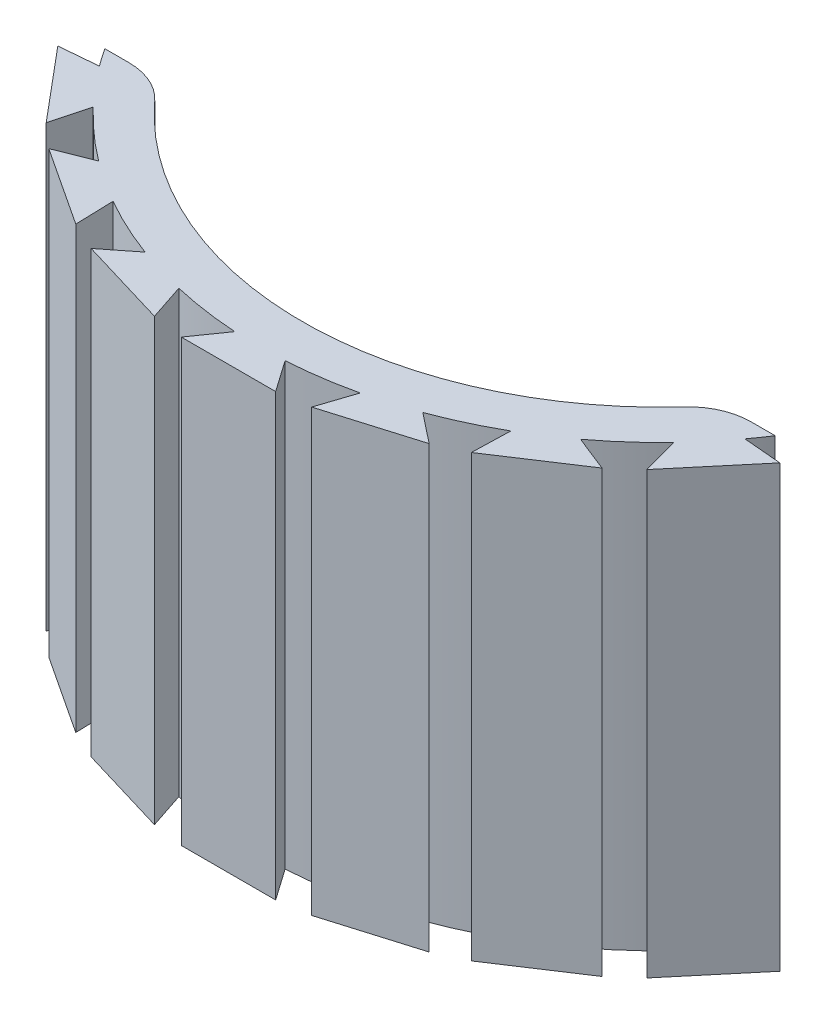
ISO-10303-21;
HEADER;
FILE_DESCRIPTION(('STEP AP214'),'2;1');
FILE_NAME('part.step','',(''),(''),'','','');
FILE_SCHEMA(('AUTOMOTIVE_DESIGN { 1 0 10303 214 1 1 1 1 }'));
ENDSEC;
DATA;
#1=APPLICATION_CONTEXT('core data for automotive mechanical design processes');
#2=APPLICATION_PROTOCOL_DEFINITION('international standard','automotive_design',2000,#1);
#3=PRODUCT_CONTEXT('',#1,'mechanical');
#4=PRODUCT('Part','Part','',(#3));
#5=PRODUCT_RELATED_PRODUCT_CATEGORY('part','',(#4));
#6=PRODUCT_DEFINITION_FORMATION('','',#4);
#7=PRODUCT_DEFINITION_CONTEXT('part definition',#1,'design');
#8=PRODUCT_DEFINITION('design','',#6,#7);
#9=PRODUCT_DEFINITION_SHAPE('','',#8);
#10=(LENGTH_UNIT() NAMED_UNIT(*) SI_UNIT(.MILLI.,.METRE.));
#11=(NAMED_UNIT(*) PLANE_ANGLE_UNIT() SI_UNIT($,.RADIAN.));
#12=(NAMED_UNIT(*) SI_UNIT($,.STERADIAN.) SOLID_ANGLE_UNIT());
#13=UNCERTAINTY_MEASURE_WITH_UNIT(LENGTH_MEASURE(1.E-05),#10,'distance_accuracy_value','');
#14=(GEOMETRIC_REPRESENTATION_CONTEXT(3) GLOBAL_UNCERTAINTY_ASSIGNED_CONTEXT((#13)) GLOBAL_UNIT_ASSIGNED_CONTEXT((#10,
#11,#12)) REPRESENTATION_CONTEXT('',''));
#15=CARTESIAN_POINT('',(0.,0.,0.));
#16=DIRECTION('',(0.,0.,1.));
#17=DIRECTION('',(1.,0.,0.));
#18=AXIS2_PLACEMENT_3D('',#15,#16,#17);
#19=CARTESIAN_POINT('',(-31.5269666317583,35.56,17.78));
#20=DIRECTION('',(0.,0.,1.));
#21=DIRECTION('',(1.,0.,0.));
#22=AXIS2_PLACEMENT_3D('',#19,#20,#21);
#23=PLANE('',#22);
#24=DIRECTION('',(-1.,0.,0.));
#25=VECTOR('',#24,1.);
#26=CARTESIAN_POINT('',(-31.5269666317583,35.56,17.78));
#27=LINE('',#26,#25);
#28=CARTESIAN_POINT('',(-25.1306815715372,35.56,17.78));
#29=VERTEX_POINT('',#28);
#30=CARTESIAN_POINT('',(-27.0676896871528,35.56,17.78));
#31=VERTEX_POINT('',#30);
#32=EDGE_CURVE('E486',#29,#31,#27,.T.);
#33=ORIENTED_EDGE('',*,*,#32,.F.);
#34=DIRECTION('',(0.,-1.,0.));
#35=VECTOR('',#34,1.);
#36=CARTESIAN_POINT('',(-25.1306815715372,35.56,17.78));
#37=LINE('',#36,#35);
#38=CARTESIAN_POINT('',(-25.1306815715372,0.,17.78));
#39=VERTEX_POINT('',#38);
#40=EDGE_CURVE('E488',#29,#39,#37,.T.);
#41=ORIENTED_EDGE('',*,*,#40,.T.);
#42=DIRECTION('',(-1.,0.,0.));
#43=VECTOR('',#42,1.);
#44=CARTESIAN_POINT('',(-31.5269666317583,0.,17.78));
#45=LINE('',#44,#43);
#46=CARTESIAN_POINT('',(-27.0676896871528,0.,17.78));
#47=VERTEX_POINT('',#46);
#48=EDGE_CURVE('E484',#39,#47,#45,.T.);
#49=ORIENTED_EDGE('',*,*,#48,.T.);
#50=DIRECTION('',(0.,-1.,0.));
#51=VECTOR('',#50,1.);
#52=CARTESIAN_POINT('',(-27.0676896871528,35.56,17.78));
#53=LINE('',#52,#51);
#54=EDGE_CURVE('E467',#31,#47,#53,.T.);
#55=ORIENTED_EDGE('',*,*,#54,.F.);
#56=EDGE_LOOP('',(#33,#41,#49,#55));
#57=FACE_BOUND('',#56,.T.);
#58=ADVANCED_FACE('F41',(#57),#23,.F.);
#59=CARTESIAN_POINT('',(0.,35.56,0.));
#60=DIRECTION('',(0.,1.,0.));
#61=DIRECTION('',(0.,0.,1.));
#62=AXIS2_PLACEMENT_3D('',#59,#60,#61);
#63=PLANE('',#62);
#64=CARTESIAN_POINT('',(0.,35.56,0.));
#65=DIRECTION('',(0.,-1.,0.));
#66=DIRECTION('',(0.,0.,1.));
#67=AXIS2_PLACEMENT_3D('',#64,#65,#66);
#68=CIRCLE('',#67,28.8925);
#69=CARTESIAN_POINT('',(21.3728226449522,35.56,19.4416822429907));
#70=VERTEX_POINT('',#69);
#71=CARTESIAN_POINT('',(-21.3728226449522,35.56,19.4416822429907));
#72=VERTEX_POINT('',#71);
#73=EDGE_CURVE('E483',#70,#72,#68,.T.);
#74=ORIENTED_EDGE('',*,*,#73,.T.);
#75=CARTESIAN_POINT('',(-25.1306815715372,35.56,22.86));
#76=DIRECTION('',(0.,1.,0.));
#77=DIRECTION('',(0.,0.,1.));
#78=AXIS2_PLACEMENT_3D('',#75,#76,#77);
#79=CIRCLE('',#78,5.08);
#80=EDGE_CURVE('E49',#72,#29,#79,.T.);
#81=ORIENTED_EDGE('',*,*,#80,.T.);
#82=ORIENTED_EDGE('',*,*,#32,.T.);
#83=CARTESIAN_POINT('',(0.,35.56,0.));
#84=DIRECTION('',(0.,1.,0.));
#85=DIRECTION('',(0.,0.,1.));
#86=AXIS2_PLACEMENT_3D('',#83,#84,#85);
#87=CIRCLE('',#86,32.385);
#88=CARTESIAN_POINT('',(-26.0652975121526,35.56,19.2194820586552));
#89=VERTEX_POINT('',#88);
#90=EDGE_CURVE('E465',#31,#89,#87,.T.);
#91=ORIENTED_EDGE('',*,*,#90,.T.);
#92=DIRECTION('',(-0.996194698091746,0.,0.0871557427476514));
#93=VECTOR('',#92,1.);
#94=CARTESIAN_POINT('',(-26.0652975121526,35.56,19.2194820586552));
#95=LINE('',#94,#93);
#96=CARTESIAN_POINT('',(-29.1542656112915,35.56,19.4897317493231));
#97=VERTEX_POINT('',#96);
#98=EDGE_CURVE('E322',#89,#97,#95,.T.);
#99=ORIENTED_EDGE('',*,*,#98,.T.);
#100=DIRECTION('',(0.642787609686538,0.,0.766044443118979));
#101=VECTOR('',#100,1.);
#102=CARTESIAN_POINT('',(-29.1542656112915,35.56,19.4897317493231));
#103=LINE('',#102,#101);
#104=CARTESIAN_POINT('',(-24.25622402548,35.56,25.3269904058897));
#105=VERTEX_POINT('',#104);
#106=EDGE_CURVE('E325',#97,#105,#103,.T.);
#107=ORIENTED_EDGE('',*,*,#106,.T.);
#108=DIRECTION('',(0.258819045102518,0.,-0.965925826289069));
#109=VECTOR('',#108,1.);
#110=CARTESIAN_POINT('',(-23.4536863535744,35.56,22.3318790393499));
#111=LINE('',#110,#109);
#112=CARTESIAN_POINT('',(-23.4536863535744,35.56,22.3318790393499));
#113=VERTEX_POINT('',#112);
#114=EDGE_CURVE('E316',#105,#113,#111,.T.);
#115=ORIENTED_EDGE('',*,*,#114,.T.);
#116=CARTESIAN_POINT('',(-19.4580720665701,35.56,25.8876738323891));
#117=VERTEX_POINT('',#116);
#118=EDGE_CURVE('E468',#113,#117,#87,.T.);
#119=ORIENTED_EDGE('',*,*,#118,.T.);
#120=DIRECTION('',(-0.929347524226825,0.,0.369206147312679));
#121=VECTOR('',#120,1.);
#122=CARTESIAN_POINT('',(-19.4580720665701,35.56,25.8876738323891));
#123=LINE('',#122,#121);
#124=CARTESIAN_POINT('',(-22.3397626244995,35.56,27.0324962383299));
#125=VERTEX_POINT('',#124);
#126=EDGE_CURVE('E271',#117,#125,#123,.T.);
#127=ORIENTED_EDGE('',*,*,#126,.T.);
#128=DIRECTION('',(0.835487811412936,0.,0.549508978070807));
#129=VECTOR('',#128,1.);
#130=CARTESIAN_POINT('',(-22.3397626244995,35.56,27.0324962383299));
#131=LINE('',#130,#129);
#132=CARTESIAN_POINT('',(-15.9733455015329,35.56,31.2197546512294));
#133=VERTEX_POINT('',#132);
#134=EDGE_CURVE('E298',#125,#133,#131,.T.);
#135=ORIENTED_EDGE('',*,*,#134,.T.);
#136=DIRECTION('',(-0.029084718743115,0.,-0.9995769500822));
#137=VECTOR('',#136,1.);
#138=CARTESIAN_POINT('',(-16.0635304508626,35.56,28.1202989751924));
#139=LINE('',#138,#137);
#140=CARTESIAN_POINT('',(-16.0635304508626,35.56,28.1202989751924));
#141=VERTEX_POINT('',#140);
#142=EDGE_CURVE('E294',#133,#141,#139,.T.);
#143=ORIENTED_EDGE('',*,*,#142,.T.);
#144=CARTESIAN_POINT('',(-11.2159604271536,35.56,30.3807580006906));
#145=VERTEX_POINT('',#144);
#146=EDGE_CURVE('E537',#141,#145,#87,.T.);
#147=ORIENTED_EDGE('',*,*,#146,.T.);
#148=DIRECTION('',(-0.784415664919579,0.,0.620235491268256));
#149=VECTOR('',#148,1.);
#150=CARTESIAN_POINT('',(-11.2159604271536,35.56,30.3807580006906));
#151=LINE('',#150,#149);
#152=CARTESIAN_POINT('',(-13.6482509924846,35.56,32.3039640267328));
#153=VERTEX_POINT('',#152);
#154=EDGE_CURVE('E308',#145,#153,#151,.T.);
#155=ORIENTED_EDGE('',*,*,#154,.T.);
#156=DIRECTION('',(0.957989512315489,0.,0.286803232711091));
#157=VECTOR('',#156,1.);
#158=CARTESIAN_POINT('',(-13.6482509924846,35.56,32.3039640267328));
#159=LINE('',#158,#157);
#160=CARTESIAN_POINT('',(-6.34837090864062,35.56,34.4894046599913));
#161=VERTEX_POINT('',#160);
#162=EDGE_CURVE('E427',#153,#161,#159,.T.);
#163=ORIENTED_EDGE('',*,*,#162,.T.);
#164=DIRECTION('',(-0.314544756151618,0.,-0.949242643573033));
#165=VECTOR('',#164,1.);
#166=CARTESIAN_POINT('',(-7.3237010517993,35.56,31.5460239634708));
#167=LINE('',#166,#165);
#168=CARTESIAN_POINT('',(-7.3237010517993,35.56,31.5460239634708));
#169=VERTEX_POINT('',#168);
#170=EDGE_CURVE('E418',#161,#169,#167,.T.);
#171=ORIENTED_EDGE('',*,*,#170,.T.);
#172=CARTESIAN_POINT('',(-2.03147285294732,35.56,32.3212212493238));
#173=VERTEX_POINT('',#172);
#174=EDGE_CURVE('E533',#169,#173,#87,.T.);
#175=ORIENTED_EDGE('',*,*,#174,.T.);
#176=DIRECTION('',(-0.57357643635105,0.,0.819152044288989));
#177=VECTOR('',#176,1.);
#178=CARTESIAN_POINT('',(-2.03147285294732,35.56,32.3212212493238));
#179=LINE('',#178,#177);
#180=CARTESIAN_POINT('',(-3.81,35.56,34.8612212493238));
#181=VERTEX_POINT('',#180);
#182=EDGE_CURVE('E434',#173,#181,#179,.T.);
#183=ORIENTED_EDGE('',*,*,#182,.T.);
#184=DIRECTION('',(1.,0.,0.));
#185=VECTOR('',#184,1.);
#186=CARTESIAN_POINT('',(-3.81,35.56,34.8612212493238));
#187=LINE('',#186,#185);
#188=CARTESIAN_POINT('',(3.81,35.56,34.8612212493238));
#189=VERTEX_POINT('',#188);
#190=EDGE_CURVE('E453',#181,#189,#187,.T.);
#191=ORIENTED_EDGE('',*,*,#190,.T.);
#192=DIRECTION('',(-0.57357643635105,0.,-0.819152044288989));
#193=VECTOR('',#192,1.);
#194=CARTESIAN_POINT('',(2.03147285294732,35.56,32.3212212493238));
#195=LINE('',#194,#193);
#196=CARTESIAN_POINT('',(2.03147285294732,35.56,32.3212212493238));
#197=VERTEX_POINT('',#196);
#198=EDGE_CURVE('E444',#189,#197,#195,.T.);
#199=ORIENTED_EDGE('',*,*,#198,.T.);
#200=CARTESIAN_POINT('',(7.3237010517993,35.56,31.5460239634708));
#201=VERTEX_POINT('',#200);
#202=EDGE_CURVE('E470',#197,#201,#87,.T.);
#203=ORIENTED_EDGE('',*,*,#202,.T.);
#204=DIRECTION('',(-0.314544756151618,0.,0.949242643573033));
#205=VECTOR('',#204,1.);
#206=CARTESIAN_POINT('',(7.3237010517993,35.56,31.5460239634708));
#207=LINE('',#206,#205);
#208=CARTESIAN_POINT('',(6.34837090864062,35.56,34.4894046599913));
#209=VERTEX_POINT('',#208);
#210=EDGE_CURVE('E348',#201,#209,#207,.T.);
#211=ORIENTED_EDGE('',*,*,#210,.T.);
#212=DIRECTION('',(0.957989512315489,0.,-0.286803232711091));
#213=VECTOR('',#212,1.);
#214=CARTESIAN_POINT('',(6.34837090864062,35.56,34.4894046599913));
#215=LINE('',#214,#213);
#216=CARTESIAN_POINT('',(13.6482509924846,35.56,32.3039640267328));
#217=VERTEX_POINT('',#216);
#218=EDGE_CURVE('E351',#209,#217,#215,.T.);
#219=ORIENTED_EDGE('',*,*,#218,.T.);
#220=DIRECTION('',(-0.784415664919579,0.,-0.620235491268256));
#221=VECTOR('',#220,1.);
#222=CARTESIAN_POINT('',(11.2159604271536,35.56,30.3807580006906));
#223=LINE('',#222,#221);
#224=CARTESIAN_POINT('',(11.2159604271536,35.56,30.3807580006906));
#225=VERTEX_POINT('',#224);
#226=EDGE_CURVE('E341',#217,#225,#223,.T.);
#227=ORIENTED_EDGE('',*,*,#226,.T.);
#228=CARTESIAN_POINT('',(16.0635304508626,35.56,28.1202989751924));
#229=VERTEX_POINT('',#228);
#230=EDGE_CURVE('E530',#225,#229,#87,.T.);
#231=ORIENTED_EDGE('',*,*,#230,.T.);
#232=DIRECTION('',(-0.029084718743115,0.,0.9995769500822));
#233=VECTOR('',#232,1.);
#234=CARTESIAN_POINT('',(16.0635304508626,35.56,28.1202989751924));
#235=LINE('',#234,#233);
#236=CARTESIAN_POINT('',(15.9733455015329,35.56,31.2197546512294));
#237=VERTEX_POINT('',#236);
#238=EDGE_CURVE('E374',#229,#237,#235,.T.);
#239=ORIENTED_EDGE('',*,*,#238,.T.);
#240=DIRECTION('',(0.835487811412936,0.,-0.549508978070807));
#241=VECTOR('',#240,1.);
#242=CARTESIAN_POINT('',(15.9733455015329,35.56,31.2197546512294));
#243=LINE('',#242,#241);
#244=CARTESIAN_POINT('',(22.3397626244995,35.56,27.0324962383299));
#245=VERTEX_POINT('',#244);
#246=EDGE_CURVE('E377',#237,#245,#243,.T.);
#247=ORIENTED_EDGE('',*,*,#246,.T.);
#248=DIRECTION('',(-0.929347524226825,0.,-0.369206147312679));
#249=VECTOR('',#248,1.);
#250=CARTESIAN_POINT('',(19.4580720665701,35.56,25.8876738323891));
#251=LINE('',#250,#249);
#252=CARTESIAN_POINT('',(19.4580720665701,35.56,25.8876738323891));
#253=VERTEX_POINT('',#252);
#254=EDGE_CURVE('E367',#245,#253,#251,.T.);
#255=ORIENTED_EDGE('',*,*,#254,.T.);
#256=CARTESIAN_POINT('',(23.4536863535744,35.56,22.3318790393499));
#257=VERTEX_POINT('',#256);
#258=EDGE_CURVE('E528',#253,#257,#87,.T.);
#259=ORIENTED_EDGE('',*,*,#258,.T.);
#260=DIRECTION('',(0.258819045102518,0.,0.965925826289069));
#261=VECTOR('',#260,1.);
#262=CARTESIAN_POINT('',(23.4536863535744,35.56,22.3318790393499));
#263=LINE('',#262,#261);
#264=CARTESIAN_POINT('',(24.25622402548,35.56,25.3269904058897));
#265=VERTEX_POINT('',#264);
#266=EDGE_CURVE('E400',#257,#265,#263,.T.);
#267=ORIENTED_EDGE('',*,*,#266,.T.);
#268=DIRECTION('',(0.642787609686538,0.,-0.766044443118979));
#269=VECTOR('',#268,1.);
#270=CARTESIAN_POINT('',(24.25622402548,35.56,25.3269904058897));
#271=LINE('',#270,#269);
#272=CARTESIAN_POINT('',(29.1542656112915,35.56,19.4897317493231));
#273=VERTEX_POINT('',#272);
#274=EDGE_CURVE('E403',#265,#273,#271,.T.);
#275=ORIENTED_EDGE('',*,*,#274,.T.);
#276=DIRECTION('',(-0.996194698091746,0.,-0.0871557427476514));
#277=VECTOR('',#276,1.);
#278=CARTESIAN_POINT('',(26.0652975121526,35.56,19.2194820586552));
#279=LINE('',#278,#277);
#280=CARTESIAN_POINT('',(26.0652975121526,35.56,19.2194820586552));
#281=VERTEX_POINT('',#280);
#282=EDGE_CURVE('E393',#273,#281,#279,.T.);
#283=ORIENTED_EDGE('',*,*,#282,.T.);
#284=CARTESIAN_POINT('',(27.0676896871528,35.56,17.78));
#285=VERTEX_POINT('',#284);
#286=EDGE_CURVE('E469',#281,#285,#87,.T.);
#287=ORIENTED_EDGE('',*,*,#286,.T.);
#288=DIRECTION('',(-1.,0.,0.));
#289=VECTOR('',#288,1.);
#290=CARTESIAN_POINT('',(22.7738480773452,35.56,17.78));
#291=LINE('',#290,#289);
#292=CARTESIAN_POINT('',(25.1306815715372,35.56,17.78));
#293=VERTEX_POINT('',#292);
#294=EDGE_CURVE('E481',#285,#293,#291,.T.);
#295=ORIENTED_EDGE('',*,*,#294,.T.);
#296=CARTESIAN_POINT('',(25.1306815715372,35.56,22.86));
#297=DIRECTION('',(0.,1.,0.));
#298=DIRECTION('',(0.,0.,1.));
#299=AXIS2_PLACEMENT_3D('',#296,#297,#298);
#300=CIRCLE('',#299,5.08);
#301=EDGE_CURVE('E503',#293,#70,#300,.T.);
#302=ORIENTED_EDGE('',*,*,#301,.T.);
#303=EDGE_LOOP('',(#74,#81,#82,#91,#99,#107,#115,#119,#127,#135,#143,#147,#155,#163,#171,#175,
#183,#191,#199,#203,#211,#219,#227,#231,#239,#247,#255,#259,#267,#275,#283,#287,#295,#302));
#304=FACE_BOUND('',#303,.T.);
#305=ADVANCED_FACE('F507',(#304),#63,.T.);
#306=CARTESIAN_POINT('',(0.,0.,0.));
#307=DIRECTION('',(0.,1.,0.));
#308=DIRECTION('',(0.,0.,1.));
#309=AXIS2_PLACEMENT_3D('',#306,#307,#308);
#310=PLANE('',#309);
#311=ORIENTED_EDGE('',*,*,#48,.F.);
#312=CARTESIAN_POINT('',(-25.1306815715372,0.,22.86));
#313=DIRECTION('',(0.,1.,0.));
#314=DIRECTION('',(0.,0.,1.));
#315=AXIS2_PLACEMENT_3D('',#312,#313,#314);
#316=CIRCLE('',#315,5.08);
#317=CARTESIAN_POINT('',(-21.3728226449522,0.,19.4416822429907));
#318=VERTEX_POINT('',#317);
#319=EDGE_CURVE('E497',#39,#318,#316,.F.);
#320=ORIENTED_EDGE('',*,*,#319,.T.);
#321=CARTESIAN_POINT('',(0.,0.,0.));
#322=DIRECTION('',(0.,-1.,0.));
#323=DIRECTION('',(0.,0.,1.));
#324=AXIS2_PLACEMENT_3D('',#321,#322,#323);
#325=CIRCLE('',#324,28.8925);
#326=CARTESIAN_POINT('',(21.3728226449522,0.,19.4416822429907));
#327=VERTEX_POINT('',#326);
#328=EDGE_CURVE('E490',#327,#318,#325,.T.);
#329=ORIENTED_EDGE('',*,*,#328,.F.);
#330=CARTESIAN_POINT('',(25.1306815715372,0.,22.86));
#331=DIRECTION('',(0.,1.,0.));
#332=DIRECTION('',(0.,0.,1.));
#333=AXIS2_PLACEMENT_3D('',#330,#331,#332);
#334=CIRCLE('',#333,5.08);
#335=CARTESIAN_POINT('',(25.1306815715372,0.,17.78));
#336=VERTEX_POINT('',#335);
#337=EDGE_CURVE('E495',#327,#336,#334,.F.);
#338=ORIENTED_EDGE('',*,*,#337,.T.);
#339=DIRECTION('',(-1.,0.,0.));
#340=VECTOR('',#339,1.);
#341=CARTESIAN_POINT('',(22.7738480773452,0.,17.78));
#342=LINE('',#341,#340);
#343=CARTESIAN_POINT('',(27.0676896871528,0.,17.78));
#344=VERTEX_POINT('',#343);
#345=EDGE_CURVE('E480',#344,#336,#342,.T.);
#346=ORIENTED_EDGE('',*,*,#345,.F.);
#347=CARTESIAN_POINT('',(0.,0.,0.));
#348=DIRECTION('',(0.,1.,0.));
#349=DIRECTION('',(0.,0.,1.));
#350=AXIS2_PLACEMENT_3D('',#347,#348,#349);
#351=CIRCLE('',#350,32.385);
#352=CARTESIAN_POINT('',(26.0652975121526,0.,19.2194820586552));
#353=VERTEX_POINT('',#352);
#354=EDGE_CURVE('E288',#353,#344,#351,.T.);
#355=ORIENTED_EDGE('',*,*,#354,.F.);
#356=DIRECTION('',(-0.996194698091746,0.,-0.0871557427476514));
#357=VECTOR('',#356,1.);
#358=CARTESIAN_POINT('',(26.0652975121526,0.,19.2194820586552));
#359=LINE('',#358,#357);
#360=CARTESIAN_POINT('',(29.1542656112915,0.,19.4897317493231));
#361=VERTEX_POINT('',#360);
#362=EDGE_CURVE('E396',#361,#353,#359,.T.);
#363=ORIENTED_EDGE('',*,*,#362,.F.);
#364=DIRECTION('',(0.642787609686538,0.,-0.766044443118979));
#365=VECTOR('',#364,1.);
#366=CARTESIAN_POINT('',(24.25622402548,0.,25.3269904058897));
#367=LINE('',#366,#365);
#368=CARTESIAN_POINT('',(24.25622402548,0.,25.3269904058897));
#369=VERTEX_POINT('',#368);
#370=EDGE_CURVE('E392',#369,#361,#367,.T.);
#371=ORIENTED_EDGE('',*,*,#370,.F.);
#372=DIRECTION('',(0.258819045102518,0.,0.965925826289069));
#373=VECTOR('',#372,1.);
#374=CARTESIAN_POINT('',(23.4536863535744,0.,22.3318790393499));
#375=LINE('',#374,#373);
#376=CARTESIAN_POINT('',(23.4536863535744,0.,22.3318790393499));
#377=VERTEX_POINT('',#376);
#378=EDGE_CURVE('E389',#377,#369,#375,.T.);
#379=ORIENTED_EDGE('',*,*,#378,.F.);
#380=CARTESIAN_POINT('',(19.4580720665701,0.,25.8876738323891));
#381=VERTEX_POINT('',#380);
#382=EDGE_CURVE('E661',#381,#377,#351,.T.);
#383=ORIENTED_EDGE('',*,*,#382,.F.);
#384=DIRECTION('',(-0.929347524226825,0.,-0.369206147312679));
#385=VECTOR('',#384,1.);
#386=CARTESIAN_POINT('',(19.4580720665701,0.,25.8876738323891));
#387=LINE('',#386,#385);
#388=CARTESIAN_POINT('',(22.3397626244995,0.,27.0324962383299));
#389=VERTEX_POINT('',#388);
#390=EDGE_CURVE('E370',#389,#381,#387,.T.);
#391=ORIENTED_EDGE('',*,*,#390,.F.);
#392=DIRECTION('',(0.835487811412936,0.,-0.549508978070807));
#393=VECTOR('',#392,1.);
#394=CARTESIAN_POINT('',(15.9733455015329,0.,31.2197546512294));
#395=LINE('',#394,#393);
#396=CARTESIAN_POINT('',(15.9733455015329,0.,31.2197546512294));
#397=VERTEX_POINT('',#396);
#398=EDGE_CURVE('E366',#397,#389,#395,.T.);
#399=ORIENTED_EDGE('',*,*,#398,.F.);
#400=DIRECTION('',(-0.029084718743115,0.,0.9995769500822));
#401=VECTOR('',#400,1.);
#402=CARTESIAN_POINT('',(16.0635304508626,0.,28.1202989751924));
#403=LINE('',#402,#401);
#404=CARTESIAN_POINT('',(16.0635304508626,0.,28.1202989751924));
#405=VERTEX_POINT('',#404);
#406=EDGE_CURVE('E363',#405,#397,#403,.T.);
#407=ORIENTED_EDGE('',*,*,#406,.F.);
#408=CARTESIAN_POINT('',(11.2159604271536,0.,30.3807580006906));
#409=VERTEX_POINT('',#408);
#410=EDGE_CURVE('E646',#409,#405,#351,.T.);
#411=ORIENTED_EDGE('',*,*,#410,.F.);
#412=DIRECTION('',(-0.784415664919579,0.,-0.620235491268256));
#413=VECTOR('',#412,1.);
#414=CARTESIAN_POINT('',(11.2159604271536,0.,30.3807580006906));
#415=LINE('',#414,#413);
#416=CARTESIAN_POINT('',(13.6482509924846,0.,32.3039640267328));
#417=VERTEX_POINT('',#416);
#418=EDGE_CURVE('E344',#417,#409,#415,.T.);
#419=ORIENTED_EDGE('',*,*,#418,.F.);
#420=DIRECTION('',(0.957989512315489,0.,-0.286803232711091));
#421=VECTOR('',#420,1.);
#422=CARTESIAN_POINT('',(6.34837090864062,0.,34.4894046599913));
#423=LINE('',#422,#421);
#424=CARTESIAN_POINT('',(6.34837090864062,0.,34.4894046599913));
#425=VERTEX_POINT('',#424);
#426=EDGE_CURVE('E340',#425,#417,#423,.T.);
#427=ORIENTED_EDGE('',*,*,#426,.F.);
#428=DIRECTION('',(-0.314544756151618,0.,0.949242643573033));
#429=VECTOR('',#428,1.);
#430=CARTESIAN_POINT('',(7.3237010517993,0.,31.5460239634708));
#431=LINE('',#430,#429);
#432=CARTESIAN_POINT('',(7.3237010517993,0.,31.5460239634708));
#433=VERTEX_POINT('',#432);
#434=EDGE_CURVE('E337',#433,#425,#431,.T.);
#435=ORIENTED_EDGE('',*,*,#434,.F.);
#436=CARTESIAN_POINT('',(2.03147285294732,0.,32.3212212493238));
#437=VERTEX_POINT('',#436);
#438=EDGE_CURVE('E474',#437,#433,#351,.T.);
#439=ORIENTED_EDGE('',*,*,#438,.F.);
#440=DIRECTION('',(-0.57357643635105,0.,-0.819152044288989));
#441=VECTOR('',#440,1.);
#442=CARTESIAN_POINT('',(2.03147285294732,0.,32.3212212493238));
#443=LINE('',#442,#441);
#444=CARTESIAN_POINT('',(3.81,0.,34.8612212493238));
#445=VERTEX_POINT('',#444);
#446=EDGE_CURVE('E447',#445,#437,#443,.T.);
#447=ORIENTED_EDGE('',*,*,#446,.F.);
#448=DIRECTION('',(1.,0.,0.));
#449=VECTOR('',#448,1.);
#450=CARTESIAN_POINT('',(-3.81,0.,34.8612212493238));
#451=LINE('',#450,#449);
#452=CARTESIAN_POINT('',(-3.81,0.,34.8612212493238));
#453=VERTEX_POINT('',#452);
#454=EDGE_CURVE('E443',#453,#445,#451,.T.);
#455=ORIENTED_EDGE('',*,*,#454,.F.);
#456=DIRECTION('',(-0.57357643635105,0.,0.819152044288989));
#457=VECTOR('',#456,1.);
#458=CARTESIAN_POINT('',(-2.03147285294732,0.,32.3212212493238));
#459=LINE('',#458,#457);
#460=CARTESIAN_POINT('',(-2.03147285294732,0.,32.3212212493238));
#461=VERTEX_POINT('',#460);
#462=EDGE_CURVE('E440',#461,#453,#459,.T.);
#463=ORIENTED_EDGE('',*,*,#462,.F.);
#464=CARTESIAN_POINT('',(-7.3237010517993,0.,31.5460239634708));
#465=VERTEX_POINT('',#464);
#466=EDGE_CURVE('E473',#465,#461,#351,.T.);
#467=ORIENTED_EDGE('',*,*,#466,.F.);
#468=DIRECTION('',(-0.314544756151618,0.,-0.949242643573033));
#469=VECTOR('',#468,1.);
#470=CARTESIAN_POINT('',(-7.3237010517993,0.,31.5460239634708));
#471=LINE('',#470,#469);
#472=CARTESIAN_POINT('',(-6.34837090864062,0.,34.4894046599913));
#473=VERTEX_POINT('',#472);
#474=EDGE_CURVE('E421',#473,#465,#471,.T.);
#475=ORIENTED_EDGE('',*,*,#474,.F.);
#476=DIRECTION('',(0.957989512315489,0.,0.286803232711091));
#477=VECTOR('',#476,1.);
#478=CARTESIAN_POINT('',(-13.6482509924846,0.,32.3039640267328));
#479=LINE('',#478,#477);
#480=CARTESIAN_POINT('',(-13.6482509924846,0.,32.3039640267328));
#481=VERTEX_POINT('',#480);
#482=EDGE_CURVE('E417',#481,#473,#479,.T.);
#483=ORIENTED_EDGE('',*,*,#482,.F.);
#484=DIRECTION('',(-0.784415664919579,0.,0.620235491268256));
#485=VECTOR('',#484,1.);
#486=CARTESIAN_POINT('',(-11.2159604271536,0.,30.3807580006906));
#487=LINE('',#486,#485);
#488=CARTESIAN_POINT('',(-11.2159604271536,0.,30.3807580006906));
#489=VERTEX_POINT('',#488);
#490=EDGE_CURVE('E414',#489,#481,#487,.T.);
#491=ORIENTED_EDGE('',*,*,#490,.F.);
#492=CARTESIAN_POINT('',(-16.0635304508626,0.,28.1202989751924));
#493=VERTEX_POINT('',#492);
#494=EDGE_CURVE('E286',#493,#489,#351,.T.);
#495=ORIENTED_EDGE('',*,*,#494,.F.);
#496=DIRECTION('',(-0.029084718743115,0.,-0.9995769500822));
#497=VECTOR('',#496,1.);
#498=CARTESIAN_POINT('',(-16.0635304508626,0.,28.1202989751924));
#499=LINE('',#498,#497);
#500=CARTESIAN_POINT('',(-15.9733455015329,0.,31.2197546512294));
#501=VERTEX_POINT('',#500);
#502=EDGE_CURVE('E276',#501,#493,#499,.T.);
#503=ORIENTED_EDGE('',*,*,#502,.F.);
#504=DIRECTION('',(0.835487811412936,0.,0.549508978070807));
#505=VECTOR('',#504,1.);
#506=CARTESIAN_POINT('',(-22.3397626244995,0.,27.0324962383299));
#507=LINE('',#506,#505);
#508=CARTESIAN_POINT('',(-22.3397626244995,0.,27.0324962383299));
#509=VERTEX_POINT('',#508);
#510=EDGE_CURVE('E293',#509,#501,#507,.T.);
#511=ORIENTED_EDGE('',*,*,#510,.F.);
#512=DIRECTION('',(-0.929347524226825,0.,0.369206147312679));
#513=VECTOR('',#512,1.);
#514=CARTESIAN_POINT('',(-19.4580720665701,0.,25.8876738323891));
#515=LINE('',#514,#513);
#516=CARTESIAN_POINT('',(-19.4580720665701,0.,25.8876738323891));
#517=VERTEX_POINT('',#516);
#518=EDGE_CURVE('E268',#517,#509,#515,.T.);
#519=ORIENTED_EDGE('',*,*,#518,.F.);
#520=CARTESIAN_POINT('',(-23.4536863535744,0.,22.3318790393499));
#521=VERTEX_POINT('',#520);
#522=EDGE_CURVE('E279',#521,#517,#351,.T.);
#523=ORIENTED_EDGE('',*,*,#522,.F.);
#524=DIRECTION('',(0.258819045102518,0.,-0.965925826289069));
#525=VECTOR('',#524,1.);
#526=CARTESIAN_POINT('',(-23.4536863535744,0.,22.3318790393499));
#527=LINE('',#526,#525);
#528=CARTESIAN_POINT('',(-24.25622402548,0.,25.3269904058897));
#529=VERTEX_POINT('',#528);
#530=EDGE_CURVE('E319',#529,#521,#527,.T.);
#531=ORIENTED_EDGE('',*,*,#530,.F.);
#532=DIRECTION('',(0.642787609686538,0.,0.766044443118979));
#533=VECTOR('',#532,1.);
#534=CARTESIAN_POINT('',(-29.1542656112915,0.,19.4897317493231));
#535=LINE('',#534,#533);
#536=CARTESIAN_POINT('',(-29.1542656112915,0.,19.4897317493231));
#537=VERTEX_POINT('',#536);
#538=EDGE_CURVE('E315',#537,#529,#535,.T.);
#539=ORIENTED_EDGE('',*,*,#538,.F.);
#540=DIRECTION('',(-0.996194698091746,0.,0.0871557427476514));
#541=VECTOR('',#540,1.);
#542=CARTESIAN_POINT('',(-26.0652975121526,0.,19.2194820586552));
#543=LINE('',#542,#541);
#544=CARTESIAN_POINT('',(-26.0652975121526,0.,19.2194820586552));
#545=VERTEX_POINT('',#544);
#546=EDGE_CURVE('E312',#545,#537,#543,.T.);
#547=ORIENTED_EDGE('',*,*,#546,.F.);
#548=EDGE_CURVE('E285',#47,#545,#351,.T.);
#549=ORIENTED_EDGE('',*,*,#548,.F.);
#550=EDGE_LOOP('',(#311,#320,#329,#338,#346,#355,#363,#371,#379,#383,#391,#399,#407,#411,#419,
#427,#435,#439,#447,#455,#463,#467,#475,#483,#491,#495,#503,#511,#519,#523,#531,#539,#547,#549));
#551=FACE_BOUND('',#550,.T.);
#552=ADVANCED_FACE('F290',(#551),#310,.F.);
#553=CARTESIAN_POINT('',(22.7738480773452,35.56,17.78));
#554=DIRECTION('',(0.,0.,1.));
#555=DIRECTION('',(1.,0.,0.));
#556=AXIS2_PLACEMENT_3D('',#553,#554,#555);
#557=PLANE('',#556);
#558=ORIENTED_EDGE('',*,*,#345,.T.);
#559=DIRECTION('',(0.,-1.,0.));
#560=VECTOR('',#559,1.);
#561=CARTESIAN_POINT('',(25.1306815715372,35.56,17.78));
#562=LINE('',#561,#560);
#563=EDGE_CURVE('E11',#336,#293,#562,.F.);
#564=ORIENTED_EDGE('',*,*,#563,.T.);
#565=ORIENTED_EDGE('',*,*,#294,.F.);
#566=DIRECTION('',(0.,-1.,0.));
#567=VECTOR('',#566,1.);
#568=CARTESIAN_POINT('',(27.0676896871528,35.56,17.78));
#569=LINE('',#568,#567);
#570=EDGE_CURVE('E477',#285,#344,#569,.T.);
#571=ORIENTED_EDGE('',*,*,#570,.T.);
#572=EDGE_LOOP('',(#558,#564,#565,#571));
#573=FACE_BOUND('',#572,.T.);
#574=ADVANCED_FACE('F522',(#573),#557,.F.);
#575=CARTESIAN_POINT('',(0.,35.56,0.));
#576=DIRECTION('',(0.,-1.,0.));
#577=DIRECTION('',(0.,0.,-1.));
#578=AXIS2_PLACEMENT_3D('',#575,#576,#577);
#579=CYLINDRICAL_SURFACE('',#578,28.8925);
#580=ORIENTED_EDGE('',*,*,#328,.T.);
#581=DIRECTION('',(0.,-1.,0.));
#582=VECTOR('',#581,1.);
#583=CARTESIAN_POINT('',(-21.3728226449522,35.56,19.4416822429907));
#584=LINE('',#583,#582);
#585=EDGE_CURVE('E62',#318,#72,#584,.F.);
#586=ORIENTED_EDGE('',*,*,#585,.T.);
#587=ORIENTED_EDGE('',*,*,#73,.F.);
#588=DIRECTION('',(0.,-1.,0.));
#589=VECTOR('',#588,1.);
#590=CARTESIAN_POINT('',(21.3728226449522,35.56,19.4416822429907));
#591=LINE('',#590,#589);
#592=EDGE_CURVE('E499',#70,#327,#591,.T.);
#593=ORIENTED_EDGE('',*,*,#592,.T.);
#594=EDGE_LOOP('',(#580,#586,#587,#593));
#595=FACE_BOUND('',#594,.T.);
#596=ADVANCED_FACE('F516',(#595),#579,.F.);
#597=CARTESIAN_POINT('',(0.,35.56,0.));
#598=DIRECTION('',(0.,-1.,0.));
#599=DIRECTION('',(0.,0.,-1.));
#600=AXIS2_PLACEMENT_3D('',#597,#598,#599);
#601=CYLINDRICAL_SURFACE('',#600,32.385);
#602=DIRECTION('',(0.,1.,0.));
#603=VECTOR('',#602,1.);
#604=CARTESIAN_POINT('',(26.0652975121526,0.,19.2194820586552));
#605=LINE('',#604,#603);
#606=EDGE_CURVE('E378',#353,#281,#605,.T.);
#607=ORIENTED_EDGE('',*,*,#606,.F.);
#608=ORIENTED_EDGE('',*,*,#354,.T.);
#609=ORIENTED_EDGE('',*,*,#570,.F.);
#610=ORIENTED_EDGE('',*,*,#286,.F.);
#611=EDGE_LOOP('',(#607,#608,#609,#610));
#612=FACE_BOUND('',#611,.T.);
#613=ADVANCED_FACE('F526',(#612),#601,.T.);
#614=DIRECTION('',(0.,1.,0.));
#615=VECTOR('',#614,1.);
#616=CARTESIAN_POINT('',(23.4536863535744,0.,22.3318790393499));
#617=LINE('',#616,#615);
#618=EDGE_CURVE('E399',#377,#257,#617,.T.);
#619=ORIENTED_EDGE('',*,*,#618,.T.);
#620=ORIENTED_EDGE('',*,*,#258,.F.);
#621=DIRECTION('',(0.,1.,0.));
#622=VECTOR('',#621,1.);
#623=CARTESIAN_POINT('',(19.4580720665701,0.,25.8876738323891));
#624=LINE('',#623,#622);
#625=EDGE_CURVE('E352',#381,#253,#624,.T.);
#626=ORIENTED_EDGE('',*,*,#625,.F.);
#627=ORIENTED_EDGE('',*,*,#382,.T.);
#628=EDGE_LOOP('',(#619,#620,#626,#627));
#629=FACE_BOUND('',#628,.T.);
#630=ADVANCED_FACE('F570',(#629),#601,.T.);
#631=DIRECTION('',(0.,1.,0.));
#632=VECTOR('',#631,1.);
#633=CARTESIAN_POINT('',(16.0635304508626,0.,28.1202989751924));
#634=LINE('',#633,#632);
#635=EDGE_CURVE('E373',#405,#229,#634,.T.);
#636=ORIENTED_EDGE('',*,*,#635,.T.);
#637=ORIENTED_EDGE('',*,*,#230,.F.);
#638=DIRECTION('',(0.,1.,0.));
#639=VECTOR('',#638,1.);
#640=CARTESIAN_POINT('',(11.2159604271536,0.,30.3807580006906));
#641=LINE('',#640,#639);
#642=EDGE_CURVE('E326',#409,#225,#641,.T.);
#643=ORIENTED_EDGE('',*,*,#642,.F.);
#644=ORIENTED_EDGE('',*,*,#410,.T.);
#645=EDGE_LOOP('',(#636,#637,#643,#644));
#646=FACE_BOUND('',#645,.T.);
#647=ADVANCED_FACE('F644',(#646),#601,.T.);
#648=DIRECTION('',(0.,1.,0.));
#649=VECTOR('',#648,1.);
#650=CARTESIAN_POINT('',(-23.4536863535744,0.,22.3318790393499));
#651=LINE('',#650,#649);
#652=EDGE_CURVE('E281',#521,#113,#651,.T.);
#653=ORIENTED_EDGE('',*,*,#652,.F.);
#654=ORIENTED_EDGE('',*,*,#522,.T.);
#655=DIRECTION('',(0.,1.,0.));
#656=VECTOR('',#655,1.);
#657=CARTESIAN_POINT('',(-19.4580720665701,0.,25.8876738323891));
#658=LINE('',#657,#656);
#659=EDGE_CURVE('E264',#517,#117,#658,.T.);
#660=ORIENTED_EDGE('',*,*,#659,.T.);
#661=ORIENTED_EDGE('',*,*,#118,.F.);
#662=EDGE_LOOP('',(#653,#654,#660,#661));
#663=FACE_BOUND('',#662,.T.);
#664=ADVANCED_FACE('F280',(#663),#601,.T.);
#665=DIRECTION('',(0.,1.,0.));
#666=VECTOR('',#665,1.);
#667=CARTESIAN_POINT('',(-16.0635304508626,0.,28.1202989751924));
#668=LINE('',#667,#666);
#669=EDGE_CURVE('E306',#493,#141,#668,.T.);
#670=ORIENTED_EDGE('',*,*,#669,.F.);
#671=ORIENTED_EDGE('',*,*,#494,.T.);
#672=DIRECTION('',(0.,1.,0.));
#673=VECTOR('',#672,1.);
#674=CARTESIAN_POINT('',(-11.2159604271536,0.,30.3807580006906));
#675=LINE('',#674,#673);
#676=EDGE_CURVE('E424',#489,#145,#675,.T.);
#677=ORIENTED_EDGE('',*,*,#676,.T.);
#678=ORIENTED_EDGE('',*,*,#146,.F.);
#679=EDGE_LOOP('',(#670,#671,#677,#678));
#680=FACE_BOUND('',#679,.T.);
#681=ADVANCED_FACE('F673',(#680),#601,.T.);
#682=DIRECTION('',(0.,1.,0.));
#683=VECTOR('',#682,1.);
#684=CARTESIAN_POINT('',(-7.3237010517993,0.,31.5460239634708));
#685=LINE('',#684,#683);
#686=EDGE_CURVE('E432',#465,#169,#685,.T.);
#687=ORIENTED_EDGE('',*,*,#686,.F.);
#688=ORIENTED_EDGE('',*,*,#466,.T.);
#689=DIRECTION('',(0.,1.,0.));
#690=VECTOR('',#689,1.);
#691=CARTESIAN_POINT('',(-2.03147285294732,0.,32.3212212493238));
#692=LINE('',#691,#690);
#693=EDGE_CURVE('E450',#461,#173,#692,.T.);
#694=ORIENTED_EDGE('',*,*,#693,.T.);
#695=ORIENTED_EDGE('',*,*,#174,.F.);
#696=EDGE_LOOP('',(#687,#688,#694,#695));
#697=FACE_BOUND('',#696,.T.);
#698=ADVANCED_FACE('F565',(#697),#601,.T.);
#699=DIRECTION('',(0.,1.,0.));
#700=VECTOR('',#699,1.);
#701=CARTESIAN_POINT('',(7.3237010517993,0.,31.5460239634708));
#702=LINE('',#701,#700);
#703=EDGE_CURVE('E347',#433,#201,#702,.T.);
#704=ORIENTED_EDGE('',*,*,#703,.T.);
#705=ORIENTED_EDGE('',*,*,#202,.F.);
#706=DIRECTION('',(0.,1.,0.));
#707=VECTOR('',#706,1.);
#708=CARTESIAN_POINT('',(2.03147285294732,0.,32.3212212493238));
#709=LINE('',#708,#707);
#710=EDGE_CURVE('E458',#437,#197,#709,.T.);
#711=ORIENTED_EDGE('',*,*,#710,.F.);
#712=ORIENTED_EDGE('',*,*,#438,.T.);
#713=EDGE_LOOP('',(#704,#705,#711,#712));
#714=FACE_BOUND('',#713,.T.);
#715=ADVANCED_FACE('F556',(#714),#601,.T.);
#716=DIRECTION('',(0.,1.,0.));
#717=VECTOR('',#716,1.);
#718=CARTESIAN_POINT('',(-26.0652975121526,0.,19.2194820586552));
#719=LINE('',#718,#717);
#720=EDGE_CURVE('E321',#545,#89,#719,.T.);
#721=ORIENTED_EDGE('',*,*,#720,.T.);
#722=ORIENTED_EDGE('',*,*,#90,.F.);
#723=ORIENTED_EDGE('',*,*,#54,.T.);
#724=ORIENTED_EDGE('',*,*,#548,.T.);
#725=EDGE_LOOP('',(#721,#722,#723,#724));
#726=FACE_BOUND('',#725,.T.);
#727=ADVANCED_FACE('F553',(#726),#601,.T.);
#728=CARTESIAN_POINT('',(2.03147285294732,0.,32.3212212493238));
#729=DIRECTION('',(0.819152044288989,0.,-0.57357643635105));
#730=DIRECTION('',(-0.57357643635105,0.,-0.819152044288989));
#731=AXIS2_PLACEMENT_3D('',#728,#729,#730);
#732=PLANE('',#731);
#733=ORIENTED_EDGE('',*,*,#198,.F.);
#734=DIRECTION('',(0.,1.,0.));
#735=VECTOR('',#734,1.);
#736=CARTESIAN_POINT('',(3.81,0.,34.8612212493238));
#737=LINE('',#736,#735);
#738=EDGE_CURVE('E460',#445,#189,#737,.T.);
#739=ORIENTED_EDGE('',*,*,#738,.F.);
#740=ORIENTED_EDGE('',*,*,#446,.T.);
#741=ORIENTED_EDGE('',*,*,#710,.T.);
#742=EDGE_LOOP('',(#733,#739,#740,#741));
#743=FACE_BOUND('',#742,.T.);
#744=ADVANCED_FACE('F555',(#743),#732,.T.);
#745=CARTESIAN_POINT('',(-3.81,0.,34.8612212493238));
#746=DIRECTION('',(0.,0.,1.));
#747=DIRECTION('',(1.,0.,0.));
#748=AXIS2_PLACEMENT_3D('',#745,#746,#747);
#749=PLANE('',#748);
#750=ORIENTED_EDGE('',*,*,#190,.F.);
#751=DIRECTION('',(0.,1.,0.));
#752=VECTOR('',#751,1.);
#753=CARTESIAN_POINT('',(-3.81,0.,34.8612212493238));
#754=LINE('',#753,#752);
#755=EDGE_CURVE('E462',#453,#181,#754,.T.);
#756=ORIENTED_EDGE('',*,*,#755,.F.);
#757=ORIENTED_EDGE('',*,*,#454,.T.);
#758=ORIENTED_EDGE('',*,*,#738,.T.);
#759=EDGE_LOOP('',(#750,#756,#757,#758));
#760=FACE_BOUND('',#759,.T.);
#761=ADVANCED_FACE('F562',(#760),#749,.T.);
#762=CARTESIAN_POINT('',(-2.03147285294732,0.,32.3212212493238));
#763=DIRECTION('',(-0.819152044288989,0.,-0.57357643635105));
#764=DIRECTION('',(-0.57357643635105,0.,0.819152044288989));
#765=AXIS2_PLACEMENT_3D('',#762,#763,#764);
#766=PLANE('',#765);
#767=ORIENTED_EDGE('',*,*,#182,.F.);
#768=ORIENTED_EDGE('',*,*,#693,.F.);
#769=ORIENTED_EDGE('',*,*,#462,.T.);
#770=ORIENTED_EDGE('',*,*,#755,.T.);
#771=EDGE_LOOP('',(#767,#768,#769,#770));
#772=FACE_BOUND('',#771,.T.);
#773=ADVANCED_FACE('F603',(#772),#766,.T.);
#774=CARTESIAN_POINT('',(-7.3237010517993,0.,31.5460239634708));
#775=DIRECTION('',(0.949242643573032,0.,-0.314544756151618));
#776=DIRECTION('',(-0.314544756151618,0.,-0.949242643573033));
#777=AXIS2_PLACEMENT_3D('',#774,#775,#776);
#778=PLANE('',#777);
#779=ORIENTED_EDGE('',*,*,#170,.F.);
#780=DIRECTION('',(0.,1.,0.));
#781=VECTOR('',#780,1.);
#782=CARTESIAN_POINT('',(-6.34837090864062,0.,34.4894046599913));
#783=LINE('',#782,#781);
#784=EDGE_CURVE('E435',#473,#161,#783,.T.);
#785=ORIENTED_EDGE('',*,*,#784,.F.);
#786=ORIENTED_EDGE('',*,*,#474,.T.);
#787=ORIENTED_EDGE('',*,*,#686,.T.);
#788=EDGE_LOOP('',(#779,#785,#786,#787));
#789=FACE_BOUND('',#788,.T.);
#790=ADVANCED_FACE('F599',(#789),#778,.T.);
#791=CARTESIAN_POINT('',(-13.6482509924846,0.,32.3039640267328));
#792=DIRECTION('',(-0.286803232711091,0.,0.957989512315489));
#793=DIRECTION('',(0.957989512315489,0.,0.286803232711091));
#794=AXIS2_PLACEMENT_3D('',#791,#792,#793);
#795=PLANE('',#794);
#796=ORIENTED_EDGE('',*,*,#162,.F.);
#797=DIRECTION('',(0.,1.,0.));
#798=VECTOR('',#797,1.);
#799=CARTESIAN_POINT('',(-13.6482509924846,0.,32.3039640267328));
#800=LINE('',#799,#798);
#801=EDGE_CURVE('E437',#481,#153,#800,.T.);
#802=ORIENTED_EDGE('',*,*,#801,.F.);
#803=ORIENTED_EDGE('',*,*,#482,.T.);
#804=ORIENTED_EDGE('',*,*,#784,.T.);
#805=EDGE_LOOP('',(#796,#802,#803,#804));
#806=FACE_BOUND('',#805,.T.);
#807=ADVANCED_FACE('F602',(#806),#795,.T.);
#808=CARTESIAN_POINT('',(-11.2159604271536,0.,30.3807580006906));
#809=DIRECTION('',(-0.620235491268256,0.,-0.784415664919579));
#810=DIRECTION('',(-0.784415664919579,0.,0.620235491268256));
#811=AXIS2_PLACEMENT_3D('',#808,#809,#810);
#812=PLANE('',#811);
#813=ORIENTED_EDGE('',*,*,#154,.F.);
#814=ORIENTED_EDGE('',*,*,#676,.F.);
#815=ORIENTED_EDGE('',*,*,#490,.T.);
#816=ORIENTED_EDGE('',*,*,#801,.T.);
#817=EDGE_LOOP('',(#813,#814,#815,#816));
#818=FACE_BOUND('',#817,.T.);
#819=ADVANCED_FACE('F607',(#818),#812,.T.);
#820=CARTESIAN_POINT('',(-16.0635304508626,0.,28.1202989751924));
#821=DIRECTION('',(0.9995769500822,0.,-0.029084718743115));
#822=DIRECTION('',(-0.029084718743115,0.,-0.9995769500822));
#823=AXIS2_PLACEMENT_3D('',#820,#821,#822);
#824=PLANE('',#823);
#825=ORIENTED_EDGE('',*,*,#142,.F.);
#826=DIRECTION('',(0.,1.,0.));
#827=VECTOR('',#826,1.);
#828=CARTESIAN_POINT('',(-15.9733455015329,0.,31.2197546512294));
#829=LINE('',#828,#827);
#830=EDGE_CURVE('E309',#501,#133,#829,.T.);
#831=ORIENTED_EDGE('',*,*,#830,.F.);
#832=ORIENTED_EDGE('',*,*,#502,.T.);
#833=ORIENTED_EDGE('',*,*,#669,.T.);
#834=EDGE_LOOP('',(#825,#831,#832,#833));
#835=FACE_BOUND('',#834,.T.);
#836=ADVANCED_FACE('F610',(#835),#824,.T.);
#837=CARTESIAN_POINT('',(-22.3397626244995,0.,27.0324962383299));
#838=DIRECTION('',(-0.549508978070807,0.,0.835487811412936));
#839=DIRECTION('',(0.835487811412936,0.,0.549508978070807));
#840=AXIS2_PLACEMENT_3D('',#837,#838,#839);
#841=PLANE('',#840);
#842=ORIENTED_EDGE('',*,*,#134,.F.);
#843=DIRECTION('',(0.,1.,0.));
#844=VECTOR('',#843,1.);
#845=CARTESIAN_POINT('',(-22.3397626244995,0.,27.0324962383299));
#846=LINE('',#845,#844);
#847=EDGE_CURVE('E275',#509,#125,#846,.T.);
#848=ORIENTED_EDGE('',*,*,#847,.F.);
#849=ORIENTED_EDGE('',*,*,#510,.T.);
#850=ORIENTED_EDGE('',*,*,#830,.T.);
#851=EDGE_LOOP('',(#842,#848,#849,#850));
#852=FACE_BOUND('',#851,.T.);
#853=ADVANCED_FACE('F831',(#852),#841,.T.);
#854=CARTESIAN_POINT('',(-19.4580720665701,0.,25.8876738323891));
#855=DIRECTION('',(-0.369206147312679,0.,-0.929347524226825));
#856=DIRECTION('',(-0.929347524226825,0.,0.369206147312679));
#857=AXIS2_PLACEMENT_3D('',#854,#855,#856);
#858=PLANE('',#857);
#859=ORIENTED_EDGE('',*,*,#126,.F.);
#860=ORIENTED_EDGE('',*,*,#659,.F.);
#861=ORIENTED_EDGE('',*,*,#518,.T.);
#862=ORIENTED_EDGE('',*,*,#847,.T.);
#863=EDGE_LOOP('',(#859,#860,#861,#862));
#864=FACE_BOUND('',#863,.T.);
#865=ADVANCED_FACE('F266',(#864),#858,.T.);
#866=CARTESIAN_POINT('',(-23.4536863535744,0.,22.3318790393499));
#867=DIRECTION('',(0.965925826289069,0.,0.258819045102518));
#868=DIRECTION('',(0.258819045102518,0.,-0.965925826289069));
#869=AXIS2_PLACEMENT_3D('',#866,#867,#868);
#870=PLANE('',#869);
#871=ORIENTED_EDGE('',*,*,#114,.F.);
#872=DIRECTION('',(0.,1.,0.));
#873=VECTOR('',#872,1.);
#874=CARTESIAN_POINT('',(-24.25622402548,0.,25.3269904058897));
#875=LINE('',#874,#873);
#876=EDGE_CURVE('E332',#529,#105,#875,.T.);
#877=ORIENTED_EDGE('',*,*,#876,.F.);
#878=ORIENTED_EDGE('',*,*,#530,.T.);
#879=ORIENTED_EDGE('',*,*,#652,.T.);
#880=EDGE_LOOP('',(#871,#877,#878,#879));
#881=FACE_BOUND('',#880,.T.);
#882=ADVANCED_FACE('F544',(#881),#870,.T.);
#883=CARTESIAN_POINT('',(-29.1542656112915,0.,19.4897317493231));
#884=DIRECTION('',(-0.766044443118979,0.,0.642787609686538));
#885=DIRECTION('',(0.642787609686538,0.,0.766044443118979));
#886=AXIS2_PLACEMENT_3D('',#883,#884,#885);
#887=PLANE('',#886);
#888=ORIENTED_EDGE('',*,*,#106,.F.);
#889=DIRECTION('',(0.,1.,0.));
#890=VECTOR('',#889,1.);
#891=CARTESIAN_POINT('',(-29.1542656112915,0.,19.4897317493231));
#892=LINE('',#891,#890);
#893=EDGE_CURVE('E334',#537,#97,#892,.T.);
#894=ORIENTED_EDGE('',*,*,#893,.F.);
#895=ORIENTED_EDGE('',*,*,#538,.T.);
#896=ORIENTED_EDGE('',*,*,#876,.T.);
#897=EDGE_LOOP('',(#888,#894,#895,#896));
#898=FACE_BOUND('',#897,.T.);
#899=ADVANCED_FACE('F548',(#898),#887,.T.);
#900=CARTESIAN_POINT('',(-26.0652975121526,0.,19.2194820586552));
#901=DIRECTION('',(-0.0871557427476514,0.,-0.996194698091746));
#902=DIRECTION('',(-0.996194698091746,0.,0.0871557427476514));
#903=AXIS2_PLACEMENT_3D('',#900,#901,#902);
#904=PLANE('',#903);
#905=ORIENTED_EDGE('',*,*,#98,.F.);
#906=ORIENTED_EDGE('',*,*,#720,.F.);
#907=ORIENTED_EDGE('',*,*,#546,.T.);
#908=ORIENTED_EDGE('',*,*,#893,.T.);
#909=EDGE_LOOP('',(#905,#906,#907,#908));
#910=FACE_BOUND('',#909,.T.);
#911=ADVANCED_FACE('F551',(#910),#904,.T.);
#912=CARTESIAN_POINT('',(11.2159604271536,0.,30.3807580006906));
#913=DIRECTION('',(0.620235491268256,0.,-0.784415664919579));
#914=DIRECTION('',(-0.784415664919579,0.,-0.620235491268256));
#915=AXIS2_PLACEMENT_3D('',#912,#913,#914);
#916=PLANE('',#915);
#917=ORIENTED_EDGE('',*,*,#226,.F.);
#918=DIRECTION('',(0.,1.,0.));
#919=VECTOR('',#918,1.);
#920=CARTESIAN_POINT('',(13.6482509924846,0.,32.3039640267328));
#921=LINE('',#920,#919);
#922=EDGE_CURVE('E358',#417,#217,#921,.T.);
#923=ORIENTED_EDGE('',*,*,#922,.F.);
#924=ORIENTED_EDGE('',*,*,#418,.T.);
#925=ORIENTED_EDGE('',*,*,#642,.T.);
#926=EDGE_LOOP('',(#917,#923,#924,#925));
#927=FACE_BOUND('',#926,.T.);
#928=ADVANCED_FACE('F640',(#927),#916,.T.);
#929=CARTESIAN_POINT('',(6.34837090864062,0.,34.4894046599913));
#930=DIRECTION('',(0.286803232711091,0.,0.957989512315489));
#931=DIRECTION('',(0.957989512315489,0.,-0.286803232711091));
#932=AXIS2_PLACEMENT_3D('',#929,#930,#931);
#933=PLANE('',#932);
#934=ORIENTED_EDGE('',*,*,#218,.F.);
#935=DIRECTION('',(0.,1.,0.));
#936=VECTOR('',#935,1.);
#937=CARTESIAN_POINT('',(6.34837090864062,0.,34.4894046599913));
#938=LINE('',#937,#936);
#939=EDGE_CURVE('E360',#425,#209,#938,.T.);
#940=ORIENTED_EDGE('',*,*,#939,.F.);
#941=ORIENTED_EDGE('',*,*,#426,.T.);
#942=ORIENTED_EDGE('',*,*,#922,.T.);
#943=EDGE_LOOP('',(#934,#940,#941,#942));
#944=FACE_BOUND('',#943,.T.);
#945=ADVANCED_FACE('F636',(#944),#933,.T.);
#946=CARTESIAN_POINT('',(7.3237010517993,0.,31.5460239634708));
#947=DIRECTION('',(-0.949242643573032,0.,-0.314544756151618));
#948=DIRECTION('',(-0.314544756151618,0.,0.949242643573033));
#949=AXIS2_PLACEMENT_3D('',#946,#947,#948);
#950=PLANE('',#949);
#951=ORIENTED_EDGE('',*,*,#210,.F.);
#952=ORIENTED_EDGE('',*,*,#703,.F.);
#953=ORIENTED_EDGE('',*,*,#434,.T.);
#954=ORIENTED_EDGE('',*,*,#939,.T.);
#955=EDGE_LOOP('',(#951,#952,#953,#954));
#956=FACE_BOUND('',#955,.T.);
#957=ADVANCED_FACE('F632',(#956),#950,.T.);
#958=CARTESIAN_POINT('',(19.4580720665701,0.,25.8876738323891));
#959=DIRECTION('',(0.369206147312679,0.,-0.929347524226825));
#960=DIRECTION('',(-0.929347524226825,0.,-0.369206147312679));
#961=AXIS2_PLACEMENT_3D('',#958,#959,#960);
#962=PLANE('',#961);
#963=ORIENTED_EDGE('',*,*,#254,.F.);
#964=DIRECTION('',(0.,1.,0.));
#965=VECTOR('',#964,1.);
#966=CARTESIAN_POINT('',(22.3397626244995,0.,27.0324962383299));
#967=LINE('',#966,#965);
#968=EDGE_CURVE('E384',#389,#245,#967,.T.);
#969=ORIENTED_EDGE('',*,*,#968,.F.);
#970=ORIENTED_EDGE('',*,*,#390,.T.);
#971=ORIENTED_EDGE('',*,*,#625,.T.);
#972=EDGE_LOOP('',(#963,#969,#970,#971));
#973=FACE_BOUND('',#972,.T.);
#974=ADVANCED_FACE('F657',(#973),#962,.T.);
#975=CARTESIAN_POINT('',(15.9733455015329,0.,31.2197546512294));
#976=DIRECTION('',(0.549508978070807,0.,0.835487811412936));
#977=DIRECTION('',(0.835487811412936,0.,-0.549508978070807));
#978=AXIS2_PLACEMENT_3D('',#975,#976,#977);
#979=PLANE('',#978);
#980=ORIENTED_EDGE('',*,*,#246,.F.);
#981=DIRECTION('',(0.,1.,0.));
#982=VECTOR('',#981,1.);
#983=CARTESIAN_POINT('',(15.9733455015329,0.,31.2197546512294));
#984=LINE('',#983,#982);
#985=EDGE_CURVE('E386',#397,#237,#984,.T.);
#986=ORIENTED_EDGE('',*,*,#985,.F.);
#987=ORIENTED_EDGE('',*,*,#398,.T.);
#988=ORIENTED_EDGE('',*,*,#968,.T.);
#989=EDGE_LOOP('',(#980,#986,#987,#988));
#990=FACE_BOUND('',#989,.T.);
#991=ADVANCED_FACE('F653',(#990),#979,.T.);
#992=CARTESIAN_POINT('',(16.0635304508626,0.,28.1202989751924));
#993=DIRECTION('',(-0.9995769500822,0.,-0.029084718743115));
#994=DIRECTION('',(-0.029084718743115,0.,0.9995769500822));
#995=AXIS2_PLACEMENT_3D('',#992,#993,#994);
#996=PLANE('',#995);
#997=ORIENTED_EDGE('',*,*,#238,.F.);
#998=ORIENTED_EDGE('',*,*,#635,.F.);
#999=ORIENTED_EDGE('',*,*,#406,.T.);
#1000=ORIENTED_EDGE('',*,*,#985,.T.);
#1001=EDGE_LOOP('',(#997,#998,#999,#1000));
#1002=FACE_BOUND('',#1001,.T.);
#1003=ADVANCED_FACE('F649',(#1002),#996,.T.);
#1004=CARTESIAN_POINT('',(26.0652975121526,0.,19.2194820586552));
#1005=DIRECTION('',(0.0871557427476514,0.,-0.996194698091746));
#1006=DIRECTION('',(-0.996194698091746,0.,-0.0871557427476514));
#1007=AXIS2_PLACEMENT_3D('',#1004,#1005,#1006);
#1008=PLANE('',#1007);
#1009=ORIENTED_EDGE('',*,*,#282,.F.);
#1010=DIRECTION('',(0.,1.,0.));
#1011=VECTOR('',#1010,1.);
#1012=CARTESIAN_POINT('',(29.1542656112915,0.,19.4897317493231));
#1013=LINE('',#1012,#1011);
#1014=EDGE_CURVE('E409',#361,#273,#1013,.T.);
#1015=ORIENTED_EDGE('',*,*,#1014,.F.);
#1016=ORIENTED_EDGE('',*,*,#362,.T.);
#1017=ORIENTED_EDGE('',*,*,#606,.T.);
#1018=EDGE_LOOP('',(#1009,#1015,#1016,#1017));
#1019=FACE_BOUND('',#1018,.T.);
#1020=ADVANCED_FACE('F593',(#1019),#1008,.T.);
#1021=CARTESIAN_POINT('',(24.25622402548,0.,25.3269904058897));
#1022=DIRECTION('',(0.766044443118979,0.,0.642787609686538));
#1023=DIRECTION('',(0.642787609686538,0.,-0.766044443118979));
#1024=AXIS2_PLACEMENT_3D('',#1021,#1022,#1023);
#1025=PLANE('',#1024);
#1026=ORIENTED_EDGE('',*,*,#274,.F.);
#1027=DIRECTION('',(0.,1.,0.));
#1028=VECTOR('',#1027,1.);
#1029=CARTESIAN_POINT('',(24.25622402548,0.,25.3269904058897));
#1030=LINE('',#1029,#1028);
#1031=EDGE_CURVE('E411',#369,#265,#1030,.T.);
#1032=ORIENTED_EDGE('',*,*,#1031,.F.);
#1033=ORIENTED_EDGE('',*,*,#370,.T.);
#1034=ORIENTED_EDGE('',*,*,#1014,.T.);
#1035=EDGE_LOOP('',(#1026,#1032,#1033,#1034));
#1036=FACE_BOUND('',#1035,.T.);
#1037=ADVANCED_FACE('F587',(#1036),#1025,.T.);
#1038=CARTESIAN_POINT('',(23.4536863535744,0.,22.3318790393499));
#1039=DIRECTION('',(-0.965925826289069,0.,0.258819045102518));
#1040=DIRECTION('',(0.258819045102518,0.,0.965925826289069));
#1041=AXIS2_PLACEMENT_3D('',#1038,#1039,#1040);
#1042=PLANE('',#1041);
#1043=ORIENTED_EDGE('',*,*,#266,.F.);
#1044=ORIENTED_EDGE('',*,*,#618,.F.);
#1045=ORIENTED_EDGE('',*,*,#378,.T.);
#1046=ORIENTED_EDGE('',*,*,#1031,.T.);
#1047=EDGE_LOOP('',(#1043,#1044,#1045,#1046));
#1048=FACE_BOUND('',#1047,.T.);
#1049=ADVANCED_FACE('F582',(#1048),#1042,.T.);
#1050=CARTESIAN_POINT('',(-25.1306815715372,35.56,22.86));
#1051=DIRECTION('',(0.,-1.,0.));
#1052=DIRECTION('',(0.,0.,-1.));
#1053=AXIS2_PLACEMENT_3D('',#1050,#1051,#1052);
#1054=CYLINDRICAL_SURFACE('',#1053,5.08);
#1055=ORIENTED_EDGE('',*,*,#80,.F.);
#1056=ORIENTED_EDGE('',*,*,#585,.F.);
#1057=ORIENTED_EDGE('',*,*,#319,.F.);
#1058=ORIENTED_EDGE('',*,*,#40,.F.);
#1059=EDGE_LOOP('',(#1055,#1056,#1057,#1058));
#1060=FACE_BOUND('',#1059,.T.);
#1061=ADVANCED_FACE('F513',(#1060),#1054,.T.);
#1062=CARTESIAN_POINT('',(25.1306815715372,35.56,22.86));
#1063=DIRECTION('',(0.,-1.,0.));
#1064=DIRECTION('',(0.,0.,-1.));
#1065=AXIS2_PLACEMENT_3D('',#1062,#1063,#1064);
#1066=CYLINDRICAL_SURFACE('',#1065,5.08);
#1067=ORIENTED_EDGE('',*,*,#301,.F.);
#1068=ORIENTED_EDGE('',*,*,#563,.F.);
#1069=ORIENTED_EDGE('',*,*,#337,.F.);
#1070=ORIENTED_EDGE('',*,*,#592,.F.);
#1071=EDGE_LOOP('',(#1067,#1068,#1069,#1070));
#1072=FACE_BOUND('',#1071,.T.);
#1073=ADVANCED_FACE('F43',(#1072),#1066,.T.);
#1074=CLOSED_SHELL('',(#58,#305,#552,#574,#596,#613,#630,#647,#664,#681,#698,#715,#727,#744,
#761,#773,#790,#807,#819,#836,#853,#865,#882,#899,#911,#928,#945,#957,#974,#991,#1003,#1020,
#1037,#1049,#1061,#1073));
#1075=MANIFOLD_SOLID_BREP('B2',#1074);
#1076=ADVANCED_BREP_SHAPE_REPRESENTATION('',(#18,#1075),#14);
#1077=SHAPE_DEFINITION_REPRESENTATION(#9,#1076);
ENDSEC;
END-ISO-10303-21;
